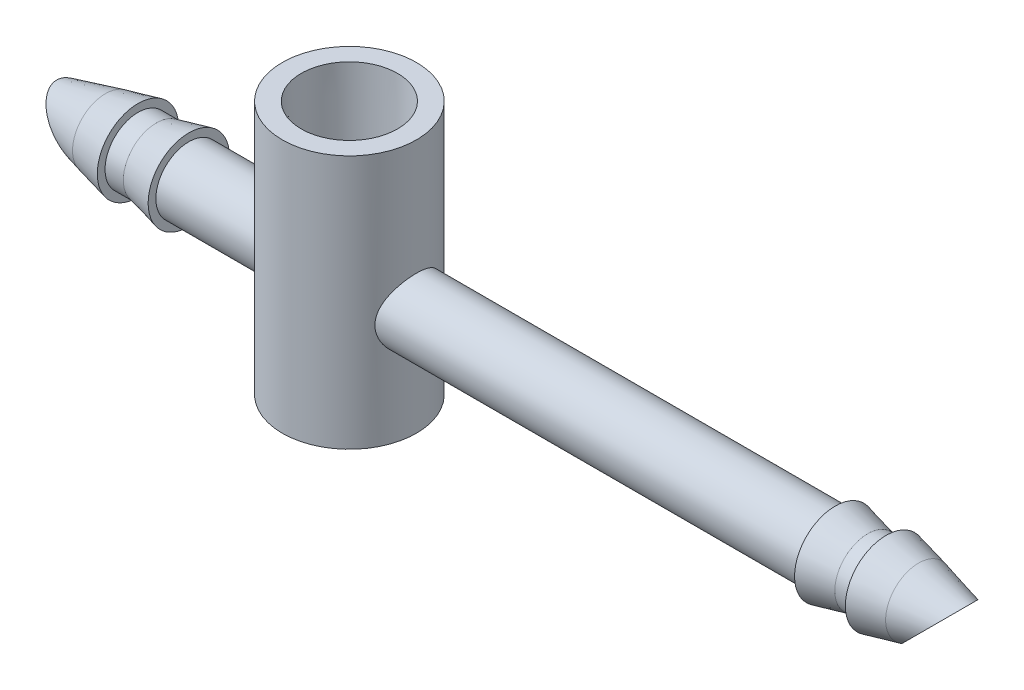
ISO-10303-21;
HEADER;
FILE_DESCRIPTION(('STEP AP214'),'2;1');
FILE_NAME('part.step','',(''),(''),'','','');
FILE_SCHEMA(('AUTOMOTIVE_DESIGN { 1 0 10303 214 1 1 1 1 }'));
ENDSEC;
DATA;
#1=APPLICATION_CONTEXT('core data for automotive mechanical design processes');
#2=APPLICATION_PROTOCOL_DEFINITION('international standard','automotive_design',2000,#1);
#3=PRODUCT_CONTEXT('',#1,'mechanical');
#4=PRODUCT('Part','Part','',(#3));
#5=PRODUCT_RELATED_PRODUCT_CATEGORY('part','',(#4));
#6=PRODUCT_DEFINITION_FORMATION('','',#4);
#7=PRODUCT_DEFINITION_CONTEXT('part definition',#1,'design');
#8=PRODUCT_DEFINITION('design','',#6,#7);
#9=PRODUCT_DEFINITION_SHAPE('','',#8);
#10=(LENGTH_UNIT() NAMED_UNIT(*) SI_UNIT(.MILLI.,.METRE.));
#11=(NAMED_UNIT(*) PLANE_ANGLE_UNIT() SI_UNIT($,.RADIAN.));
#12=(NAMED_UNIT(*) SI_UNIT($,.STERADIAN.) SOLID_ANGLE_UNIT());
#13=UNCERTAINTY_MEASURE_WITH_UNIT(LENGTH_MEASURE(1.E-05),#10,'distance_accuracy_value','');
#14=(GEOMETRIC_REPRESENTATION_CONTEXT(3) GLOBAL_UNCERTAINTY_ASSIGNED_CONTEXT((#13)) GLOBAL_UNIT_ASSIGNED_CONTEXT((#10,
#11,#12)) REPRESENTATION_CONTEXT('',''));
#15=CARTESIAN_POINT('',(0.,0.,0.));
#16=DIRECTION('',(0.,0.,1.));
#17=DIRECTION('',(1.,0.,0.));
#18=AXIS2_PLACEMENT_3D('',#15,#16,#17);
#19=CARTESIAN_POINT('',(-28.4481004842469,6.604,0.));
#20=DIRECTION('',(1.,0.,0.));
#21=DIRECTION('',(0.,0.,-1.));
#22=AXIS2_PLACEMENT_3D('',#19,#20,#21);
#23=CYLINDRICAL_SURFACE('',#22,0.9906);
#24=CARTESIAN_POINT('',(-12.7289734303222,5.89888257400853,-0.695771352933691));
#25=CARTESIAN_POINT('',(-12.7198210557029,5.93729081542466,-0.734691909886504));
#26=CARTESIAN_POINT('',(-12.7106974482991,5.97899520891978,-0.770494047879035));
#27=CARTESIAN_POINT('',(-12.6936329451425,6.06799191534761,-0.834872759712388));
#28=CARTESIAN_POINT('',(-12.6856951378107,6.11529826391608,-0.86343059613292));
#29=CARTESIAN_POINT('',(-12.6720920998009,6.21436475017099,-0.912429075577457));
#30=CARTESIAN_POINT('',(-12.6664302151197,6.26613131044383,-0.932857766922668));
#31=CARTESIAN_POINT('',(-12.6583027401911,6.3725464706193,-0.964779094447687));
#32=CARTESIAN_POINT('',(-12.6558337597402,6.42719194941512,-0.976281203610409));
#33=CARTESIAN_POINT('',(-12.6546245786434,6.53525361433799,-0.989644115704922));
#34=CARTESIAN_POINT('',(-12.6557256529603,6.58861866643314,-0.991905488491464));
#35=CARTESIAN_POINT('',(-12.6613194785732,6.69484414038392,-0.987856821692699));
#36=CARTESIAN_POINT('',(-12.6658125488571,6.74770451430548,-0.981545975919998));
#37=CARTESIAN_POINT('',(-12.6776374831539,6.85028673509259,-0.960891015949048));
#38=CARTESIAN_POINT('',(-12.6849063951821,6.90005158004341,-0.946722098687032));
#39=CARTESIAN_POINT('',(-12.7015927221418,6.99646385075008,-0.910991534371383));
#40=CARTESIAN_POINT('',(-12.7110106644189,7.0431105077023,-0.889428072133162));
#41=CARTESIAN_POINT('',(-12.7317169304972,7.13484614458355,-0.838097896427136));
#42=CARTESIAN_POINT('',(-12.7430811251007,7.17969600369928,-0.807934680140224));
#43=CARTESIAN_POINT('',(-12.7661877379024,7.26386507367981,-0.740788105056009));
#44=CARTESIAN_POINT('',(-12.7779302970076,7.30318219414291,-0.703802180606799));
#45=CARTESIAN_POINT('',(-12.8013452744523,7.37736069372691,-0.621633339734724));
#46=CARTESIAN_POINT('',(-12.8129790877963,7.4118630751004,-0.576113841297732));
#47=CARTESIAN_POINT('',(-12.8342895633808,7.47269814680199,-0.479488313833545));
#48=CARTESIAN_POINT('',(-12.8439665620611,7.49903224193901,-0.428383247477666));
#49=CARTESIAN_POINT('',(-12.8601255485324,7.54203163803995,-0.32330312733805));
#50=CARTESIAN_POINT('',(-12.8666818824728,7.55892379902835,-0.269432805053773));
#51=CARTESIAN_POINT('',(-12.8762406599685,7.58332857997896,-0.15931091584928));
#52=CARTESIAN_POINT('',(-12.8792449156975,7.59084598279504,-0.103060578333509));
#53=CARTESIAN_POINT('',(-12.8812966034906,7.59599065941,0.00624903850359188));
#54=CARTESIAN_POINT('',(-12.8805906725758,7.59423437004041,0.0592755883970689));
#55=CARTESIAN_POINT('',(-12.8758598203524,7.58231938156515,0.164218409567229));
#56=CARTESIAN_POINT('',(-12.8718351256625,7.57216125617092,0.216134756404773));
#57=CARTESIAN_POINT('',(-12.8609447546203,7.54406243823438,0.316628186865464));
#58=CARTESIAN_POINT('',(-12.8541230442007,7.5262419866593,0.36524394513302));
#59=CARTESIAN_POINT('',(-12.8382587039336,7.48344419022272,0.458819378163169));
#60=CARTESIAN_POINT('',(-12.829215579395,7.45846525101728,0.503778235591009));
#61=CARTESIAN_POINT('',(-12.8091614111647,7.40056067789199,0.591335503362882));
#62=CARTESIAN_POINT('',(-12.7980717644769,7.36728557959903,0.63368459113759));
#63=CARTESIAN_POINT('',(-12.7752831079412,7.29442366062914,0.71237740098369));
#64=CARTESIAN_POINT('',(-12.7635838436361,7.25483418986139,0.748718588488571));
#65=CARTESIAN_POINT('',(-12.7399851634869,7.16782519884078,0.816453936094898));
#66=CARTESIAN_POINT('',(-12.7281117211841,7.12008985461989,0.847453102720782));
#67=CARTESIAN_POINT('',(-12.7061175695556,7.01969531666786,0.900954697243561));
#68=CARTESIAN_POINT('',(-12.6959966317266,6.96703676623825,0.923458233310035));
#69=CARTESIAN_POINT('',(-12.6788009517392,6.85912832641404,0.958834626440317));
#70=CARTESIAN_POINT('',(-12.6716762199282,6.80393955145375,0.971868408568312));
#71=CARTESIAN_POINT('',(-12.6610394391697,6.69181737237689,0.988322755007606));
#72=CARTESIAN_POINT('',(-12.6575252437086,6.63488502559643,0.991749033209678));
#73=CARTESIAN_POINT('',(-12.6545414373469,6.52512819698705,0.988873577453069));
#74=CARTESIAN_POINT('',(-12.654808341205,6.47229253417721,0.983229728436972));
#75=CARTESIAN_POINT('',(-12.6585609395088,6.36831491477222,0.963607746403885));
#76=CARTESIAN_POINT('',(-12.6620466888997,6.31717298710438,0.9496294711206));
#77=CARTESIAN_POINT('',(-12.6715973711185,6.21863217812165,0.914051818481583));
#78=CARTESIAN_POINT('',(-12.677628840721,6.17119387577139,0.892551918353956));
#79=CARTESIAN_POINT('',(-12.6914637554091,6.08045415028152,0.842540108838486));
#80=CARTESIAN_POINT('',(-12.6992676801297,6.03715385142046,0.814026301279018));
#81=CARTESIAN_POINT('',(-12.7162049689566,5.95329440621155,0.748897175483832));
#82=CARTESIAN_POINT('',(-12.7253887269193,5.9130316786326,0.711913034733178));
#83=CARTESIAN_POINT('',(-12.7436232443848,5.83910049929975,0.631813993044503));
#84=CARTESIAN_POINT('',(-12.7526739701062,5.80543369659719,0.588697563607564));
#85=CARTESIAN_POINT('',(-12.7699017696517,5.74452124539252,0.495757820823608));
#86=CARTESIAN_POINT('',(-12.7780377789376,5.71753807930111,0.445754064036738));
#87=CARTESIAN_POINT('',(-12.7920627832801,5.67243482662575,0.341602860397827));
#88=CARTESIAN_POINT('',(-12.7979523737161,5.65431239127973,0.287456516049863));
#89=CARTESIAN_POINT('',(-12.8066000691089,5.62805967896882,0.178498683675544));
#90=CARTESIAN_POINT('',(-12.8094574172375,5.61961196200246,0.123771738304363));
#91=CARTESIAN_POINT('',(-12.812043330463,5.61195732012748,0.0136147931504438));
#92=CARTESIAN_POINT('',(-12.8117731022372,5.61274683132501,-0.0418149272439259));
#93=CARTESIAN_POINT('',(-12.8082158928685,5.62330168193909,-0.149406651972828));
#94=CARTESIAN_POINT('',(-12.8050527618175,5.63269855103012,-0.201609577144477));
#95=CARTESIAN_POINT('',(-12.7962317962432,5.65962173514863,-0.303687043615899));
#96=CARTESIAN_POINT('',(-12.7905722136143,5.67715374714477,-0.353559926224267));
#97=CARTESIAN_POINT('',(-12.7772598620385,5.72012873859672,-0.450465189321868));
#98=CARTESIAN_POINT('',(-12.7695757179812,5.74569759103285,-0.497437053190829));
#99=CARTESIAN_POINT('',(-12.7531042200017,5.80388961315551,-0.586454303403846));
#100=CARTESIAN_POINT('',(-12.7443194414757,5.83649643925595,-0.628510761260257));
#101=CARTESIAN_POINT('',(-12.7333044227002,5.88089856275711,-0.677186166317929));
#102=CARTESIAN_POINT('',(-12.7311381218884,5.88979837458205,-0.686565982208218));
#103=CARTESIAN_POINT('',(-12.7289734303222,5.89888257400853,-0.695771352933691));
#104=B_SPLINE_CURVE_WITH_KNOTS('',3,(#24,#25,#26,#27,#28,#29,#30,#31,#32,#33,#34,#35,#36,#37,
#38,#39,#40,#41,#42,#43,#44,#45,#46,#47,#48,#49,#50,#51,#52,#53,#54,#55,#56,#57,#58,#59,#60,#61,
#62,#63,#64,#65,#66,#67,#68,#69,#70,#71,#72,#73,#74,#75,#76,#77,#78,#79,#80,#81,#82,#83,#84,#85,
#86,#87,#88,#89,#90,#91,#92,#93,#94,#95,#96,#97,#98,#99,#100,#101,#102,#103),.UNSPECIFIED.,.T.,
.F.,(4,2,2,2,2,2,2,2,2,2,2,2,2,2,2,2,2,2,2,2,2,2,2,2,2,2,2,2,2,2,2,2,2,2,2,2,2,2,2,4),(0.,
0.166292525898598,0.333010880590813,0.499973451222633,0.666758596215862,0.826231853063031,
0.985720108854799,1.14178773158851,1.29789369266173,1.46286991978877,1.62790831250002,
1.80192955347372,1.97592084908256,2.1455290321176,2.31505064828308,2.47345175193191,
2.63184204020396,2.78783264597879,2.94385802113901,3.10810732301385,3.27242574126022,
3.4460186424927,3.61958889244673,3.79013579432564,3.96058124495641,4.11921135606181,
4.27784417501581,4.43445371299175,4.59110568087919,4.75667640908608,4.92228847905946,
5.09363083880099,5.26492775523477,5.43042684687933,5.59586208801305,5.75453032784382,
5.91330984972286,6.07471172639925,6.23574275240292,6.27507375045692),.UNSPECIFIED.);
#105=CARTESIAN_POINT('',(-12.7289734303222,5.89888257400853,-0.695771352933691));
#106=VERTEX_POINT('',#105);
#107=EDGE_CURVE('E50',#106,#106,#104,.T.);
#108=ORIENTED_EDGE('',*,*,#107,.T.);
#109=EDGE_LOOP('',(#108));
#110=FACE_BOUND('',#109,.T.);
#111=CARTESIAN_POINT('',(-27.178,6.604,0.));
#112=DIRECTION('',(-0.707106781186549,-0.707106781186546,0.));
#113=DIRECTION('',(0.707106781186546,-0.707106781186549,0.));
#114=AXIS2_PLACEMENT_3D('',#111,#112,#113);
#115=ELLIPSE('',#114,1.40091995488679,0.9906);
#116=CARTESIAN_POINT('',(-26.1874,5.6134,0.));
#117=VERTEX_POINT('',#116);
#118=EDGE_CURVE('E150',#117,#117,#115,.T.);
#119=ORIENTED_EDGE('',*,*,#118,.T.);
#120=EDGE_LOOP('',(#119));
#121=FACE_BOUND('',#120,.T.);
#122=ADVANCED_FACE('F45',(#110,#121),#23,.F.);
#123=CARTESIAN_POINT('',(25.4,6.604,-3.54734504026462E-13));
#124=DIRECTION('',(-1.,0.,0.));
#125=DIRECTION('',(0.,0.,-1.));
#126=AXIS2_PLACEMENT_3D('',#123,#124,#125);
#127=CONICAL_SURFACE('',#126,2.0574,0.233179800646816);
#128=CARTESIAN_POINT('',(23.368,6.604,0.));
#129=DIRECTION('',(-1.,0.,0.));
#130=DIRECTION('',(0.,0.,1.));
#131=AXIS2_PLACEMENT_3D('',#128,#129,#130);
#132=CIRCLE('',#131,2.54);
#133=CARTESIAN_POINT('',(23.368,6.604,2.53999999999992));
#134=VERTEX_POINT('',#133);
#135=EDGE_CURVE('E429',#134,#134,#132,.T.);
#136=ORIENTED_EDGE('',*,*,#135,.F.);
#137=EDGE_LOOP('',(#136));
#138=FACE_BOUND('',#137,.T.);
#139=CARTESIAN_POINT('',(25.4,6.604,-3.54734504026462E-13));
#140=DIRECTION('',(-1.,0.,0.));
#141=DIRECTION('',(0.,0.,1.));
#142=AXIS2_PLACEMENT_3D('',#139,#140,#141);
#143=CIRCLE('',#142,2.0574);
#144=CARTESIAN_POINT('',(25.399999999998,4.82599999999802,1.03518634071084));
#145=VERTEX_POINT('',#144);
#146=CARTESIAN_POINT('',(25.4,4.82599999999998,-1.03518634071392));
#147=VERTEX_POINT('',#146);
#148=EDGE_CURVE('E95',#145,#147,#143,.T.);
#149=ORIENTED_EDGE('',*,*,#148,.T.);
#150=CARTESIAN_POINT('',(26.7664434509025,6.19244345090247,-3.6406410642274E-13));
#151=DIRECTION('',(0.707106781186549,-0.707106781186546,0.));
#152=DIRECTION('',(-0.707106781186546,-0.707106781186549,0.));
#153=AXIS2_PLACEMENT_3D('',#150,#151,#152);
#154=ELLIPSE('',#153,2.45064780386188,1.68328801343724);
#155=EDGE_CURVE('E96',#147,#145,#154,.F.);
#156=ORIENTED_EDGE('',*,*,#155,.T.);
#157=EDGE_LOOP('',(#149,#156));
#158=FACE_BOUND('',#157,.T.);
#159=ADVANCED_FACE('F129',(#138,#158),#127,.T.);
#160=CARTESIAN_POINT('',(28.448,6.604,-3.7601857426805E-13));
#161=DIRECTION('',(-1.,0.,0.));
#162=DIRECTION('',(0.,0.,-1.));
#163=AXIS2_PLACEMENT_3D('',#160,#161,#162);
#164=CONICAL_SURFACE('',#163,1.27,0.252806291901757);
#165=ORIENTED_EDGE('',*,*,#148,.F.);
#166=CARTESIAN_POINT('',(26.7356404494382,6.16164044943821,-3.63833126489173E-13));
#167=DIRECTION('',(0.707106781186549,-0.707106781186546,0.));
#168=DIRECTION('',(-0.707106781186546,-0.707106781186549,0.));
#169=AXIS2_PLACEMENT_3D('',#166,#167,#168);
#170=ELLIPSE('',#169,2.42164210006358,1.65423494656199);
#171=CARTESIAN_POINT('',(28.448,7.874,-3.76876041564533E-13));
#172=VERTEX_POINT('',#171);
#173=EDGE_CURVE('E12',#145,#172,#170,.F.);
#174=ORIENTED_EDGE('',*,*,#173,.T.);
#175=CARTESIAN_POINT('',(28.448,6.604,-3.7601857426805E-13));
#176=DIRECTION('',(-1.,0.,0.));
#177=DIRECTION('',(0.,0.,1.));
#178=AXIS2_PLACEMENT_3D('',#175,#176,#177);
#179=CIRCLE('',#178,1.27);
#180=CARTESIAN_POINT('',(28.448,7.87400000137654,-0.00053696174757791));
#181=VERTEX_POINT('',#180);
#182=EDGE_CURVE('E89',#172,#181,#179,.T.);
#183=ORIENTED_EDGE('',*,*,#182,.T.);
#184=EDGE_CURVE('E59',#181,#147,#170,.F.);
#185=ORIENTED_EDGE('',*,*,#184,.T.);
#186=EDGE_LOOP('',(#165,#174,#183,#185));
#187=FACE_BOUND('',#186,.T.);
#188=ADVANCED_FACE('F101',(#187),#164,.T.);
#189=CARTESIAN_POINT('',(25.4,6.604,0.));
#190=DIRECTION('',(-1.,0.,0.));
#191=DIRECTION('',(0.,0.,1.));
#192=AXIS2_PLACEMENT_3D('',#189,#190,#191);
#193=CYLINDRICAL_SURFACE('',#192,2.0574);
#194=CARTESIAN_POINT('',(-6.50875552174331,6.604,2.0574));
#195=CARTESIAN_POINT('',(-6.50874557928772,6.71150420791799,2.05739168198061));
#196=CARTESIAN_POINT('',(-6.50393545640232,6.81915507082698,2.04891744821865));
#197=CARTESIAN_POINT('',(-6.48538025318272,7.03117468118683,2.01543880223582));
#198=CARTESIAN_POINT('',(-6.47161571946703,7.13553576285349,1.9903983981367));
#199=CARTESIAN_POINT('',(-6.43712952178396,7.33751453308569,1.92511268920919));
#200=CARTESIAN_POINT('',(-6.4164438571538,7.43516402645166,1.88494592910289));
#201=CARTESIAN_POINT('',(-6.37050135456076,7.62231413016998,1.79078659512008));
#202=CARTESIAN_POINT('',(-6.34524441337746,7.71181455644601,1.7367937090352));
#203=CARTESIAN_POINT('',(-6.29055366642618,7.88797473907386,1.61148805270902));
#204=CARTESIAN_POINT('',(-6.26094745491142,7.97384556438868,1.53914091610817));
#205=CARTESIAN_POINT('',(-6.20228788038235,8.13284483653371,1.38133387499145));
#206=CARTESIAN_POINT('',(-6.17323479081451,8.20596711948638,1.29586766479248));
#207=CARTESIAN_POINT('',(-6.11671561310839,8.34199800251583,1.10751810770709));
#208=CARTESIAN_POINT('',(-6.08947224018541,8.40394550808865,1.00386753386904));
#209=CARTESIAN_POINT('',(-6.04186517826461,8.50916581326021,0.786028878270575));
#210=CARTESIAN_POINT('',(-6.02149730240946,8.55244998243134,0.671847263561792));
#211=CARTESIAN_POINT('',(-5.9911761439073,8.61602142068051,0.444538201979344));
#212=CARTESIAN_POINT('',(-5.98060119031474,8.63768947934949,0.331881704783649));
#213=CARTESIAN_POINT('',(-5.96874368730402,8.66195104834268,0.104073400678027));
#214=CARTESIAN_POINT('',(-5.96745574605245,8.6645556265141,-0.0110769194143754));
#215=CARTESIAN_POINT('',(-5.97401417713941,8.65117165883461,-0.230263521114504));
#216=CARTESIAN_POINT('',(-5.98110324314691,8.63672474906178,-0.334421700036052));
#217=CARTESIAN_POINT('',(-6.00248661444408,8.59239314297677,-0.538613201212911));
#218=CARTESIAN_POINT('',(-6.01678145742144,8.56250729462268,-0.63864621504995));
#219=CARTESIAN_POINT('',(-6.05151342863848,8.48792584674471,-0.8335252963867));
#220=CARTESIAN_POINT('',(-6.07203491091923,8.44302593598992,-0.928277516195344));
#221=CARTESIAN_POINT('',(-6.11735215279327,8.33995962449312,-1.10913684766394));
#222=CARTESIAN_POINT('',(-6.1421494580255,8.28178842393505,-1.19524081525091));
#223=CARTESIAN_POINT('',(-6.19636293845209,8.1476753244575,-1.36480619586473));
#224=CARTESIAN_POINT('',(-6.22599416395538,8.07059104875171,-1.44729614506715));
#225=CARTESIAN_POINT('',(-6.28504407463586,7.90391194505644,-1.59869141906319));
#226=CARTESIAN_POINT('',(-6.31446259186725,7.81430817101006,-1.66758694401346));
#227=CARTESIAN_POINT('',(-6.37163576662624,7.61858216504068,-1.79384143564679));
#228=CARTESIAN_POINT('',(-6.39918705295435,7.5117940524363,-1.85026921905771));
#229=CARTESIAN_POINT('',(-6.44672790512336,7.28856343765559,-1.94393382379989));
#230=CARTESIAN_POINT('',(-6.46672511524617,7.17213084143848,-1.98119005952042));
#231=CARTESIAN_POINT('',(-6.49472357113542,6.94252300139371,-2.03249282174962));
#232=CARTESIAN_POINT('',(-6.5035409680045,6.82980564370966,-2.04812721141078));
#233=CARTESIAN_POINT('',(-6.51050940255273,6.6030389072869,-2.06052512165686));
#234=CARTESIAN_POINT('',(-6.50866737322001,6.48899044248177,-2.05730090803485));
#235=CARTESIAN_POINT('',(-6.49538899144927,6.2753763352689,-2.03353043997576));
#236=CARTESIAN_POINT('',(-6.48496613023685,6.17553411990587,-2.01481290154899));
#237=CARTESIAN_POINT('',(-6.45717502217301,5.98058365576457,-1.96326739292366));
#238=CARTESIAN_POINT('',(-6.43980462439449,5.88547688332231,-1.93043505260796));
#239=CARTESIAN_POINT('',(-6.39912462437631,5.69768664631415,-1.84997597836781));
#240=CARTESIAN_POINT('',(-6.37557671203645,5.60532071922807,-1.80173312165812));
#241=CARTESIAN_POINT('',(-6.32542126500839,5.42946809021876,-1.69236650089145));
#242=CARTESIAN_POINT('',(-6.29881217166028,5.34598595366473,-1.63123616161635));
#243=CARTESIAN_POINT('',(-6.24167285361336,5.17974104156459,-1.48920358128868));
#244=CARTESIAN_POINT('',(-6.21105679710818,5.09827958601018,-1.40680586118399));
#245=CARTESIAN_POINT('',(-6.1521546359557,4.94995154018412,-1.22899377168047));
#246=CARTESIAN_POINT('',(-6.12386923152608,4.88308932620433,-1.13357551311444));
#247=CARTESIAN_POINT('',(-6.07196117298785,4.76460334212062,-0.929382875633139));
#248=CARTESIAN_POINT('',(-6.0484599645003,4.71336309028509,-0.820352928064257));
#249=CARTESIAN_POINT('',(-6.00968338112619,4.63045130432911,-0.593736424667756));
#250=CARTESIAN_POINT('',(-5.99440104365052,4.59876320330623,-0.476157207500129));
#251=CARTESIAN_POINT('',(-5.97485896815806,4.55849399041956,-0.247154096980267));
#252=CARTESIAN_POINT('',(-5.96973435719073,4.54809702182788,-0.136122518123854));
#253=CARTESIAN_POINT('',(-5.96841432607618,4.54540586029094,0.0861974314470987));
#254=CARTESIAN_POINT('',(-5.97221600500946,4.55310578610863,0.197485706995968));
#255=CARTESIAN_POINT('',(-5.98781723734876,4.58516434150296,0.40990480982889));
#256=CARTESIAN_POINT('',(-5.99910601005543,4.60845991146148,0.511237478123646));
#257=CARTESIAN_POINT('',(-6.02810230285126,4.66964835915245,0.708405927560609));
#258=CARTESIAN_POINT('',(-6.04581077591086,4.70754340415187,0.804240890149963));
#259=CARTESIAN_POINT('',(-6.08699964167541,4.79860150017807,0.992386013312486));
#260=CARTESIAN_POINT('',(-6.11069849342235,4.85235951938473,1.08435900142147));
#261=CARTESIAN_POINT('',(-6.16134800090105,4.97285898197512,1.25836769723598));
#262=CARTESIAN_POINT('',(-6.18830015187709,5.03960640409456,1.34039880058821));
#263=CARTESIAN_POINT('',(-6.24581307752378,5.19166618766214,1.50051209137004));
#264=CARTESIAN_POINT('',(-6.27647142076428,5.27814734342916,1.5774533171089));
#265=CARTESIAN_POINT('',(-6.33572116470845,5.46328617709944,1.71612055901833));
#266=CARTESIAN_POINT('',(-6.36431083365562,5.56195387394763,1.77783392925048));
#267=CARTESIAN_POINT('',(-6.41664818932089,5.77233408403039,1.88560557359411));
#268=CARTESIAN_POINT('',(-6.44024932702002,5.88432072146761,1.93121113101302));
#269=CARTESIAN_POINT('',(-6.46856945697547,6.05778894235697,1.98449363809278));
#270=CARTESIAN_POINT('',(-6.47682492798579,6.11647040796528,1.99972648546958));
#271=CARTESIAN_POINT('',(-6.49065310198282,6.23523853494253,2.02499023479485));
#272=CARTESIAN_POINT('',(-6.4962277043888,6.29532416970121,2.03502482014852));
#273=CARTESIAN_POINT('',(-6.50311858620745,6.39692601811088,2.04737172558915));
#274=CARTESIAN_POINT('',(-6.50522709823155,6.43821983553214,2.05112839833056));
#275=CARTESIAN_POINT('',(-6.50804752994183,6.52100180546243,2.05614422088374));
#276=CARTESIAN_POINT('',(-6.50875936077097,6.56248997016754,2.05740321179273));
#277=CARTESIAN_POINT('',(-6.50875552174331,6.604,2.0574));
#278=B_SPLINE_CURVE_WITH_KNOTS('',3,(#194,#195,#196,#197,#198,#199,#200,#201,#202,#203,#204,
#205,#206,#207,#208,#209,#210,#211,#212,#213,#214,#215,#216,#217,#218,#219,#220,#221,#222,#223,
#224,#225,#226,#227,#228,#229,#230,#231,#232,#233,#234,#235,#236,#237,#238,#239,#240,#241,#242,
#243,#244,#245,#246,#247,#248,#249,#250,#251,#252,#253,#254,#255,#256,#257,#258,#259,#260,#261,
#262,#263,#264,#265,#266,#267,#268,#269,#270,#271,#272,#273,#274,#275,#276,#277),.UNSPECIFIED.,
.T.,.F.,(4,2,2,2,2,2,2,2,2,2,2,2,2,2,2,2,2,2,2,2,2,2,2,2,2,2,2,2,2,2,2,2,2,2,2,2,2,2,2,2,2,4),
(0.,0.322345220368503,0.645393082218825,0.966786119743357,1.28818641529855,1.63508966177514,
1.98216017245255,2.35158324199954,2.72078094257035,3.06450227950766,3.40802404338032,
3.72272419607124,4.03744783484194,4.35664142726778,4.67595064569247,5.02462879443859,
5.37355738461643,5.74326226404532,6.11259201519295,6.45302541805827,6.79323742482747,
7.09821203017433,7.40328112750881,7.72251451135124,8.04191116455726,8.39983273261035,
8.75786144495252,9.1240791281137,9.48998608053387,9.82311054875528,10.156126771164,
10.468484237902,10.7808880914474,11.1069472363015,11.4331568154754,11.7907795522551,
12.1486982840036,12.5159980989333,12.6993140940367,12.8825000160731,13.0069575492404,
13.1314230001561),.UNSPECIFIED.);
#279=CARTESIAN_POINT('',(-6.50875552174331,6.604,2.0574));
#280=VERTEX_POINT('',#279);
#281=EDGE_CURVE('E374',#280,#280,#278,.T.);
#282=ORIENTED_EDGE('',*,*,#281,.F.);
#283=EDGE_LOOP('',(#282));
#284=FACE_BOUND('',#283,.T.);
#285=CARTESIAN_POINT('',(20.193,6.604,0.));
#286=DIRECTION('',(1.,0.,0.));
#287=DIRECTION('',(0.,0.,-1.));
#288=AXIS2_PLACEMENT_3D('',#285,#286,#287);
#289=CIRCLE('',#288,2.0574);
#290=CARTESIAN_POINT('',(20.193,6.604,-2.0574));
#291=VERTEX_POINT('',#290);
#292=EDGE_CURVE('E428',#291,#291,#289,.F.);
#293=ORIENTED_EDGE('',*,*,#292,.T.);
#294=EDGE_LOOP('',(#293));
#295=FACE_BOUND('',#294,.T.);
#296=ADVANCED_FACE('F128',(#284,#295),#193,.T.);
#297=CARTESIAN_POINT('',(-25.4,6.604,-3.54734504026462E-13));
#298=DIRECTION('',(1.,0.,0.));
#299=DIRECTION('',(0.,0.,-1.));
#300=AXIS2_PLACEMENT_3D('',#297,#298,#299);
#301=CONICAL_SURFACE('',#300,2.0574,0.233179800646816);
#302=CARTESIAN_POINT('',(-23.368,6.604,0.));
#303=DIRECTION('',(-1.,0.,0.));
#304=DIRECTION('',(0.,0.,1.));
#305=AXIS2_PLACEMENT_3D('',#302,#303,#304);
#306=CIRCLE('',#305,2.54);
#307=CARTESIAN_POINT('',(-23.368,6.604,2.53999999999992));
#308=VERTEX_POINT('',#307);
#309=EDGE_CURVE('E337',#308,#308,#306,.T.);
#310=ORIENTED_EDGE('',*,*,#309,.T.);
#311=EDGE_LOOP('',(#310));
#312=FACE_BOUND('',#311,.T.);
#313=CARTESIAN_POINT('',(-25.4,6.604,-3.54734504026462E-13));
#314=DIRECTION('',(-1.,0.,0.));
#315=DIRECTION('',(0.,-0.864197530867275,0.503152688200018));
#316=AXIS2_PLACEMENT_3D('',#313,#314,#315);
#317=CIRCLE('',#316,2.0574);
#318=CARTESIAN_POINT('',(-25.4,4.82599999999367,1.03518634070236));
#319=VERTEX_POINT('',#318);
#320=CARTESIAN_POINT('',(-25.3999999999944,4.8259999999944,-1.03518634070697));
#321=VERTEX_POINT('',#320);
#322=EDGE_CURVE('E265',#319,#321,#317,.T.);
#323=ORIENTED_EDGE('',*,*,#322,.F.);
#324=CARTESIAN_POINT('',(-26.7664434509025,6.19244345090247,-3.6406410642274E-13));
#325=DIRECTION('',(-0.707106781186549,-0.707106781186546,0.));
#326=DIRECTION('',(0.707106781186546,-0.707106781186549,0.));
#327=AXIS2_PLACEMENT_3D('',#324,#325,#326);
#328=ELLIPSE('',#327,2.45064780386188,1.68328801343724);
#329=EDGE_CURVE('E74',#319,#321,#328,.F.);
#330=ORIENTED_EDGE('',*,*,#329,.T.);
#331=EDGE_LOOP('',(#323,#330));
#332=FACE_BOUND('',#331,.T.);
#333=ADVANCED_FACE('F342',(#312,#332),#301,.T.);
#334=CARTESIAN_POINT('',(-28.448,6.604,-3.7601857426805E-13));
#335=DIRECTION('',(1.,0.,0.));
#336=DIRECTION('',(0.,0.,-1.));
#337=AXIS2_PLACEMENT_3D('',#334,#335,#336);
#338=CONICAL_SURFACE('',#337,1.27,0.252806291901757);
#339=ORIENTED_EDGE('',*,*,#322,.T.);
#340=CARTESIAN_POINT('',(-26.7356404494382,6.16164044943821,-3.63833126489173E-13));
#341=DIRECTION('',(-0.707106781186549,-0.707106781186546,0.));
#342=DIRECTION('',(0.707106781186546,-0.707106781186549,0.));
#343=AXIS2_PLACEMENT_3D('',#340,#341,#342);
#344=ELLIPSE('',#343,2.42164210006358,1.65423494656199);
#345=CARTESIAN_POINT('',(-28.4479999097894,7.87399990978944,-0.000536961806010743));
#346=VERTEX_POINT('',#345);
#347=EDGE_CURVE('E274',#321,#346,#344,.F.);
#348=ORIENTED_EDGE('',*,*,#347,.T.);
#349=CARTESIAN_POINT('',(-28.448,6.604,-3.7601857426805E-13));
#350=DIRECTION('',(-1.,0.,0.));
#351=DIRECTION('',(0.,0.,1.));
#352=AXIS2_PLACEMENT_3D('',#349,#350,#351);
#353=CIRCLE('',#352,1.27);
#354=CARTESIAN_POINT('',(-28.448,7.874,-3.76470870858064E-13));
#355=VERTEX_POINT('',#354);
#356=EDGE_CURVE('E244',#355,#346,#353,.T.);
#357=ORIENTED_EDGE('',*,*,#356,.F.);
#358=EDGE_CURVE('E272',#355,#319,#344,.F.);
#359=ORIENTED_EDGE('',*,*,#358,.T.);
#360=EDGE_LOOP('',(#339,#348,#357,#359));
#361=FACE_BOUND('',#360,.T.);
#362=ADVANCED_FACE('F229',(#361),#338,.T.);
#363=CARTESIAN_POINT('',(-13.8112444782567,6.604,2.0574));
#364=CARTESIAN_POINT('',(-13.8112544207123,6.49649579208201,2.05739168198061));
#365=CARTESIAN_POINT('',(-13.8160645435977,6.38884492917302,2.04891744821865));
#366=CARTESIAN_POINT('',(-13.8346197468173,6.17682531881317,2.01543880223582));
#367=CARTESIAN_POINT('',(-13.848384280533,6.07246423714651,1.9903983981367));
#368=CARTESIAN_POINT('',(-13.882870478216,5.87048546691431,1.92511268920919));
#369=CARTESIAN_POINT('',(-13.9035561428462,5.77283597354834,1.88494592910289));
#370=CARTESIAN_POINT('',(-13.9494986454392,5.58568586983002,1.79078659512008));
#371=CARTESIAN_POINT('',(-13.9747555866225,5.49618544355399,1.73679370903519));
#372=CARTESIAN_POINT('',(-14.0294463335738,5.32002526092614,1.61148805270902));
#373=CARTESIAN_POINT('',(-14.0590525450886,5.23415443561132,1.53914091610817));
#374=CARTESIAN_POINT('',(-14.1177121196177,5.07515516346629,1.38133387499145));
#375=CARTESIAN_POINT('',(-14.1467652091855,5.00203288051362,1.29586766479248));
#376=CARTESIAN_POINT('',(-14.2032843868916,4.86600199748418,1.10751810770709));
#377=CARTESIAN_POINT('',(-14.2305277598146,4.80405449191135,1.00386753386904));
#378=CARTESIAN_POINT('',(-14.2781348217354,4.69883418673979,0.786028878270574));
#379=CARTESIAN_POINT('',(-14.2985026975905,4.65555001756866,0.671847263561791));
#380=CARTESIAN_POINT('',(-14.3288238560927,4.59197857931949,0.444538201979342));
#381=CARTESIAN_POINT('',(-14.3393988096853,4.57031052065051,0.331881704783647));
#382=CARTESIAN_POINT('',(-14.351256312696,4.54604895165732,0.104073400678025));
#383=CARTESIAN_POINT('',(-14.3525442539476,4.5434443734859,-0.0110769194143777));
#384=CARTESIAN_POINT('',(-14.3459858228606,4.55682834116539,-0.230263521114506));
#385=CARTESIAN_POINT('',(-14.3388967568531,4.57127525093822,-0.334421700036053));
#386=CARTESIAN_POINT('',(-14.3175133855559,4.61560685702323,-0.538613201212913));
#387=CARTESIAN_POINT('',(-14.3032185425786,4.64549270537733,-0.638646215049951));
#388=CARTESIAN_POINT('',(-14.2684865713615,4.7200741532553,-0.833525296386702));
#389=CARTESIAN_POINT('',(-14.2479650890808,4.76497406401008,-0.928277516195347));
#390=CARTESIAN_POINT('',(-14.2026478472067,4.86804037550688,-1.10913684766394));
#391=CARTESIAN_POINT('',(-14.1778505419745,4.92621157606496,-1.19524081525091));
#392=CARTESIAN_POINT('',(-14.1236370615479,5.0603246755425,-1.36480619586473));
#393=CARTESIAN_POINT('',(-14.0940058360446,5.13740895124829,-1.44729614506715));
#394=CARTESIAN_POINT('',(-14.0349559253641,5.30408805494356,-1.59869141906319));
#395=CARTESIAN_POINT('',(-14.0055374081327,5.39369182898994,-1.66758694401346));
#396=CARTESIAN_POINT('',(-13.9483642333738,5.58941783495932,-1.79384143564679));
#397=CARTESIAN_POINT('',(-13.9208129470456,5.6962059475637,-1.85026921905771));
#398=CARTESIAN_POINT('',(-13.8732720948766,5.91943656234442,-1.94393382379989));
#399=CARTESIAN_POINT('',(-13.8532748847538,6.03586915856153,-1.98119005952042));
#400=CARTESIAN_POINT('',(-13.8252764288646,6.26547699860629,-2.03249282174962));
#401=CARTESIAN_POINT('',(-13.8164590319955,6.37819435629035,-2.04812721141078));
#402=CARTESIAN_POINT('',(-13.8094905974473,6.6049610927131,-2.06052512165686));
#403=CARTESIAN_POINT('',(-13.81133262678,6.71900955751823,-2.05730090803485));
#404=CARTESIAN_POINT('',(-13.8246110085507,6.93262366473111,-2.03353043997576));
#405=CARTESIAN_POINT('',(-13.8350338697632,7.03246588009414,-2.01481290154898));
#406=CARTESIAN_POINT('',(-13.862824977827,7.22741634423543,-1.96326739292366));
#407=CARTESIAN_POINT('',(-13.8801953756055,7.32252311667769,-1.93043505260796));
#408=CARTESIAN_POINT('',(-13.9208753756237,7.51031335368585,-1.84997597836781));
#409=CARTESIAN_POINT('',(-13.9444232879636,7.60267928077194,-1.80173312165812));
#410=CARTESIAN_POINT('',(-13.9945787349916,7.77853190978125,-1.69236650089145));
#411=CARTESIAN_POINT('',(-14.0211878283397,7.86201404633528,-1.63123616161635));
#412=CARTESIAN_POINT('',(-14.0783271463866,8.02825895843541,-1.48920358128868));
#413=CARTESIAN_POINT('',(-14.1089432028918,8.10972041398983,-1.40680586118399));
#414=CARTESIAN_POINT('',(-14.1678453640443,8.25804845981589,-1.22899377168047));
#415=CARTESIAN_POINT('',(-14.1961307684739,8.32491067379567,-1.13357551311444));
#416=CARTESIAN_POINT('',(-14.2480388270121,8.44339665787938,-0.929382875633137));
#417=CARTESIAN_POINT('',(-14.2715400354997,8.49463690971491,-0.820352928064256));
#418=CARTESIAN_POINT('',(-14.3103166188738,8.57754869567089,-0.593736424667755));
#419=CARTESIAN_POINT('',(-14.3255989563495,8.60923679669377,-0.476157207500129));
#420=CARTESIAN_POINT('',(-14.3451410318419,8.64950600958044,-0.247154096980267));
#421=CARTESIAN_POINT('',(-14.3502656428093,8.65990297817212,-0.136122518123854));
#422=CARTESIAN_POINT('',(-14.3515856739238,8.66259413970906,0.0861974314470994));
#423=CARTESIAN_POINT('',(-14.3477839949905,8.65489421389137,0.197485706995969));
#424=CARTESIAN_POINT('',(-14.3321827626512,8.62283565849704,0.409904809828891));
#425=CARTESIAN_POINT('',(-14.3208939899446,8.59954008853852,0.511237478123647));
#426=CARTESIAN_POINT('',(-14.2918976971487,8.53835164084756,0.70840592756061));
#427=CARTESIAN_POINT('',(-14.2741892240891,8.50045659584813,0.804240890149964));
#428=CARTESIAN_POINT('',(-14.2330003583246,8.40939849982193,0.992386013312487));
#429=CARTESIAN_POINT('',(-14.2093015065776,8.35564048061527,1.08435900142147));
#430=CARTESIAN_POINT('',(-14.158651999099,8.23514101802488,1.25836769723598));
#431=CARTESIAN_POINT('',(-14.1316998481229,8.16839359590544,1.34039880058821));
#432=CARTESIAN_POINT('',(-14.0741869224762,8.01633381233786,1.50051209137004));
#433=CARTESIAN_POINT('',(-14.0435285792357,7.92985265657084,1.5774533171089));
#434=CARTESIAN_POINT('',(-13.9842788352915,7.74471382290056,1.71612055901833));
#435=CARTESIAN_POINT('',(-13.9556891663444,7.64604612605237,1.77783392925048));
#436=CARTESIAN_POINT('',(-13.9033518106791,7.43566591596961,1.88560557359411));
#437=CARTESIAN_POINT('',(-13.87975067298,7.32367927853239,1.93121113101302));
#438=CARTESIAN_POINT('',(-13.8514305430245,7.15021105764303,1.98449363809278));
#439=CARTESIAN_POINT('',(-13.8431750720142,7.09152959203472,1.99972648546958));
#440=CARTESIAN_POINT('',(-13.8293468980172,6.97276146505747,2.02499023479485));
#441=CARTESIAN_POINT('',(-13.8237722956112,6.91267583029879,2.03502482014852));
#442=CARTESIAN_POINT('',(-13.8168814137925,6.81107398188912,2.04737172558915));
#443=CARTESIAN_POINT('',(-13.8147729017685,6.76978016446786,2.05112839833056));
#444=CARTESIAN_POINT('',(-13.8119524700582,6.68699819453757,2.05614422088374));
#445=CARTESIAN_POINT('',(-13.811240639229,6.64551002983246,2.05740321179273));
#446=CARTESIAN_POINT('',(-13.8112444782567,6.604,2.0574));
#447=B_SPLINE_CURVE_WITH_KNOTS('',3,(#363,#364,#365,#366,#367,#368,#369,#370,#371,#372,#373,
#374,#375,#376,#377,#378,#379,#380,#381,#382,#383,#384,#385,#386,#387,#388,#389,#390,#391,#392,
#393,#394,#395,#396,#397,#398,#399,#400,#401,#402,#403,#404,#405,#406,#407,#408,#409,#410,#411,
#412,#413,#414,#415,#416,#417,#418,#419,#420,#421,#422,#423,#424,#425,#426,#427,#428,#429,#430,
#431,#432,#433,#434,#435,#436,#437,#438,#439,#440,#441,#442,#443,#444,#445,#446),.UNSPECIFIED.,
.T.,.F.,(4,2,2,2,2,2,2,2,2,2,2,2,2,2,2,2,2,2,2,2,2,2,2,2,2,2,2,2,2,2,2,2,2,2,2,2,2,2,2,2,2,4),
(0.,0.322345220368503,0.645393082218825,0.966786119743358,1.28818641529855,1.63508966177514,
1.98216017245255,2.35158324199954,2.72078094257035,3.06450227950766,3.40802404338032,
3.72272419607124,4.03744783484194,4.35664142726778,4.67595064569247,5.02462879443859,
5.37355738461643,5.74326226404533,6.11259201519295,6.45302541805827,6.79323742482747,
7.09821203017433,7.40328112750881,7.72251451135124,8.04191116455727,8.39983273261035,
8.75786144495252,9.1240791281137,9.48998608053387,9.82311054875528,10.156126771164,
10.468484237902,10.7808880914474,11.1069472363015,11.4331568154754,11.7907795522551,
12.1486982840036,12.5159980989333,12.6993140940367,12.8825000160731,13.0069575492404,
13.1314230001561),.UNSPECIFIED.);
#448=CARTESIAN_POINT('',(-13.8112444782567,6.604,2.0574));
#449=VERTEX_POINT('',#448);
#450=EDGE_CURVE('E375',#449,#449,#447,.T.);
#451=ORIENTED_EDGE('',*,*,#450,.F.);
#452=EDGE_LOOP('',(#451));
#453=FACE_BOUND('',#452,.T.);
#454=CARTESIAN_POINT('',(-20.193,6.604,0.));
#455=DIRECTION('',(-1.,0.,0.));
#456=DIRECTION('',(0.,0.,1.));
#457=AXIS2_PLACEMENT_3D('',#454,#455,#456);
#458=CIRCLE('',#457,2.0574);
#459=CARTESIAN_POINT('',(-20.193,6.604,2.0574));
#460=VERTEX_POINT('',#459);
#461=EDGE_CURVE('E330',#460,#460,#458,.F.);
#462=ORIENTED_EDGE('',*,*,#461,.T.);
#463=EDGE_LOOP('',(#462));
#464=FACE_BOUND('',#463,.T.);
#465=ADVANCED_FACE('F223',(#453,#464),#193,.T.);
#466=CARTESIAN_POINT('',(-10.16,15.875,0.));
#467=DIRECTION('',(0.,-1.,0.));
#468=DIRECTION('',(0.,0.,-1.));
#469=AXIS2_PLACEMENT_3D('',#466,#467,#468);
#470=CYLINDRICAL_SURFACE('',#469,4.191);
#471=ORIENTED_EDGE('',*,*,#281,.T.);
#472=EDGE_LOOP('',(#471));
#473=FACE_BOUND('',#472,.T.);
#474=ORIENTED_EDGE('',*,*,#450,.T.);
#475=EDGE_LOOP('',(#474));
#476=FACE_BOUND('',#475,.T.);
#477=CARTESIAN_POINT('',(-10.16,15.875,0.));
#478=DIRECTION('',(0.,1.,0.));
#479=DIRECTION('',(0.,0.,1.));
#480=AXIS2_PLACEMENT_3D('',#477,#478,#479);
#481=CIRCLE('',#480,4.191);
#482=CARTESIAN_POINT('',(-10.16,15.875,4.191));
#483=VERTEX_POINT('',#482);
#484=EDGE_CURVE('E368',#483,#483,#481,.T.);
#485=ORIENTED_EDGE('',*,*,#484,.F.);
#486=EDGE_LOOP('',(#485));
#487=FACE_BOUND('',#486,.T.);
#488=CARTESIAN_POINT('',(-10.16,0.,0.));
#489=DIRECTION('',(0.,1.,0.));
#490=DIRECTION('',(0.,0.,1.));
#491=AXIS2_PLACEMENT_3D('',#488,#489,#490);
#492=CIRCLE('',#491,4.191);
#493=CARTESIAN_POINT('',(-10.16,0.,4.191));
#494=VERTEX_POINT('',#493);
#495=EDGE_CURVE('E371',#494,#494,#492,.T.);
#496=ORIENTED_EDGE('',*,*,#495,.T.);
#497=EDGE_LOOP('',(#496));
#498=FACE_BOUND('',#497,.T.);
#499=ADVANCED_FACE('F47',(#473,#476,#487,#498),#470,.T.);
#500=CARTESIAN_POINT('',(-10.16,15.875,0.));
#501=DIRECTION('',(0.,1.,0.));
#502=DIRECTION('',(0.,0.,1.));
#503=AXIS2_PLACEMENT_3D('',#500,#501,#502);
#504=PLANE('',#503);
#505=CARTESIAN_POINT('',(-10.16,15.875,0.));
#506=DIRECTION('',(0.,1.,0.));
#507=DIRECTION('',(0.,0.,1.));
#508=AXIS2_PLACEMENT_3D('',#505,#506,#507);
#509=CIRCLE('',#508,3.0099);
#510=CARTESIAN_POINT('',(-10.16,15.875,3.0099));
#511=VERTEX_POINT('',#510);
#512=EDGE_CURVE('E195',#511,#511,#509,.T.);
#513=ORIENTED_EDGE('',*,*,#512,.F.);
#514=EDGE_LOOP('',(#513));
#515=FACE_BOUND('',#514,.T.);
#516=ORIENTED_EDGE('',*,*,#484,.T.);
#517=EDGE_LOOP('',(#516));
#518=FACE_BOUND('',#517,.T.);
#519=ADVANCED_FACE('F404',(#515,#518),#504,.T.);
#520=CARTESIAN_POINT('',(-10.16,0.,0.));
#521=DIRECTION('',(0.,1.,0.));
#522=DIRECTION('',(0.,0.,1.));
#523=AXIS2_PLACEMENT_3D('',#520,#521,#522);
#524=PLANE('',#523);
#525=ORIENTED_EDGE('',*,*,#495,.F.);
#526=EDGE_LOOP('',(#525));
#527=FACE_BOUND('',#526,.T.);
#528=ADVANCED_FACE('F400',(#527),#524,.F.);
#529=CARTESIAN_POINT('',(-20.193,6.604,0.));
#530=DIRECTION('',(-1.,0.,0.));
#531=DIRECTION('',(0.,0.,1.));
#532=AXIS2_PLACEMENT_3D('',#529,#530,#531);
#533=PLANE('',#532);
#534=ORIENTED_EDGE('',*,*,#461,.F.);
#535=EDGE_LOOP('',(#534));
#536=FACE_BOUND('',#535,.T.);
#537=CARTESIAN_POINT('',(-20.193,6.604,0.));
#538=DIRECTION('',(-1.,0.,0.));
#539=DIRECTION('',(0.,0.,1.));
#540=AXIS2_PLACEMENT_3D('',#537,#538,#539);
#541=CIRCLE('',#540,2.54);
#542=CARTESIAN_POINT('',(-20.193,6.604,2.53999999999994));
#543=VERTEX_POINT('',#542);
#544=EDGE_CURVE('E283',#543,#543,#541,.T.);
#545=ORIENTED_EDGE('',*,*,#544,.F.);
#546=EDGE_LOOP('',(#545));
#547=FACE_BOUND('',#546,.T.);
#548=ADVANCED_FACE('F307',(#536,#547),#533,.F.);
#549=CARTESIAN_POINT('',(-22.225,6.604,-3.32563597524808E-13));
#550=DIRECTION('',(1.,0.,0.));
#551=DIRECTION('',(0.,0.,-1.));
#552=AXIS2_PLACEMENT_3D('',#549,#550,#551);
#553=CONICAL_SURFACE('',#552,2.0574,0.233179800646816);
#554=CARTESIAN_POINT('',(-22.225,6.604,-3.32563597524808E-13));
#555=DIRECTION('',(1.,0.,0.));
#556=DIRECTION('',(0.,0.,-1.));
#557=AXIS2_PLACEMENT_3D('',#554,#555,#556);
#558=CIRCLE('',#557,2.0574);
#559=CARTESIAN_POINT('',(-22.225,6.604,-2.05740000000033));
#560=VERTEX_POINT('',#559);
#561=EDGE_CURVE('E275',#560,#560,#558,.T.);
#562=ORIENTED_EDGE('',*,*,#561,.T.);
#563=EDGE_LOOP('',(#562));
#564=FACE_BOUND('',#563,.T.);
#565=ORIENTED_EDGE('',*,*,#544,.T.);
#566=EDGE_LOOP('',(#565));
#567=FACE_BOUND('',#566,.T.);
#568=ADVANCED_FACE('F298',(#564,#567),#553,.T.);
#569=CARTESIAN_POINT('',(-23.368,6.604,0.));
#570=DIRECTION('',(-1.,0.,0.));
#571=DIRECTION('',(0.,0.,1.));
#572=AXIS2_PLACEMENT_3D('',#569,#570,#571);
#573=PLANE('',#572);
#574=CARTESIAN_POINT('',(-23.368,6.604,0.));
#575=DIRECTION('',(-1.,0.,0.));
#576=DIRECTION('',(0.,0.,1.));
#577=AXIS2_PLACEMENT_3D('',#574,#575,#576);
#578=CIRCLE('',#577,2.0574);
#579=CARTESIAN_POINT('',(-23.368,6.604,2.0574));
#580=VERTEX_POINT('',#579);
#581=EDGE_CURVE('E380',#580,#580,#578,.F.);
#582=ORIENTED_EDGE('',*,*,#581,.F.);
#583=EDGE_LOOP('',(#582));
#584=FACE_BOUND('',#583,.T.);
#585=ORIENTED_EDGE('',*,*,#309,.F.);
#586=EDGE_LOOP('',(#585));
#587=FACE_BOUND('',#586,.T.);
#588=ADVANCED_FACE('F220',(#584,#587),#573,.F.);
#589=ORIENTED_EDGE('',*,*,#561,.F.);
#590=EDGE_LOOP('',(#589));
#591=FACE_BOUND('',#590,.T.);
#592=ORIENTED_EDGE('',*,*,#581,.T.);
#593=EDGE_LOOP('',(#592));
#594=FACE_BOUND('',#593,.T.);
#595=ADVANCED_FACE('F213',(#591,#594),#193,.T.);
#596=CARTESIAN_POINT('',(-10.2870000000001,-10.287,0.));
#597=DIRECTION('',(-0.707106781186549,-0.707106781186546,0.));
#598=DIRECTION('',(0.707106781186546,-0.707106781186549,0.));
#599=AXIS2_PLACEMENT_3D('',#596,#597,#598);
#600=PLANE('',#599);
#601=ORIENTED_EDGE('',*,*,#118,.F.);
#602=EDGE_LOOP('',(#601));
#603=FACE_BOUND('',#602,.T.);
#604=ORIENTED_EDGE('',*,*,#329,.F.);
#605=ORIENTED_EDGE('',*,*,#358,.F.);
#606=ORIENTED_EDGE('',*,*,#356,.T.);
#607=ORIENTED_EDGE('',*,*,#347,.F.);
#608=EDGE_LOOP('',(#604,#605,#606,#607));
#609=FACE_BOUND('',#608,.T.);
#610=ADVANCED_FACE('F210',(#603,#609),#600,.T.);
#611=CARTESIAN_POINT('',(20.193,6.604,0.));
#612=DIRECTION('',(1.,0.,0.));
#613=DIRECTION('',(0.,0.,1.));
#614=AXIS2_PLACEMENT_3D('',#611,#612,#613);
#615=PLANE('',#614);
#616=ORIENTED_EDGE('',*,*,#292,.F.);
#617=EDGE_LOOP('',(#616));
#618=FACE_BOUND('',#617,.T.);
#619=CARTESIAN_POINT('',(20.193,6.604,0.));
#620=DIRECTION('',(-1.,0.,0.));
#621=DIRECTION('',(0.,0.,1.));
#622=AXIS2_PLACEMENT_3D('',#619,#620,#621);
#623=CIRCLE('',#622,2.54);
#624=CARTESIAN_POINT('',(20.193,6.604,2.53999999999994));
#625=VERTEX_POINT('',#624);
#626=EDGE_CURVE('E106',#625,#625,#623,.T.);
#627=ORIENTED_EDGE('',*,*,#626,.T.);
#628=EDGE_LOOP('',(#627));
#629=FACE_BOUND('',#628,.T.);
#630=ADVANCED_FACE('F212',(#618,#629),#615,.F.);
#631=CARTESIAN_POINT('',(22.225,6.604,-3.32563597524808E-13));
#632=DIRECTION('',(-1.,0.,0.));
#633=DIRECTION('',(0.,0.,-1.));
#634=AXIS2_PLACEMENT_3D('',#631,#632,#633);
#635=CONICAL_SURFACE('',#634,2.0574,0.233179800646816);
#636=CARTESIAN_POINT('',(22.225,6.604,-3.32563597524808E-13));
#637=DIRECTION('',(-1.,0.,0.));
#638=DIRECTION('',(0.,0.,-1.));
#639=AXIS2_PLACEMENT_3D('',#636,#637,#638);
#640=CIRCLE('',#639,2.0574);
#641=CARTESIAN_POINT('',(22.225,6.604,-2.05740000000033));
#642=VERTEX_POINT('',#641);
#643=EDGE_CURVE('E280',#642,#642,#640,.T.);
#644=ORIENTED_EDGE('',*,*,#643,.T.);
#645=EDGE_LOOP('',(#644));
#646=FACE_BOUND('',#645,.T.);
#647=ORIENTED_EDGE('',*,*,#626,.F.);
#648=EDGE_LOOP('',(#647));
#649=FACE_BOUND('',#648,.T.);
#650=ADVANCED_FACE('F131',(#646,#649),#635,.T.);
#651=CARTESIAN_POINT('',(23.368,6.604,0.));
#652=DIRECTION('',(1.,0.,0.));
#653=DIRECTION('',(0.,0.,1.));
#654=AXIS2_PLACEMENT_3D('',#651,#652,#653);
#655=PLANE('',#654);
#656=CARTESIAN_POINT('',(23.368,6.604,0.));
#657=DIRECTION('',(1.,0.,0.));
#658=DIRECTION('',(0.,0.,-1.));
#659=AXIS2_PLACEMENT_3D('',#656,#657,#658);
#660=CIRCLE('',#659,2.0574);
#661=CARTESIAN_POINT('',(23.368,6.604,-2.0574));
#662=VERTEX_POINT('',#661);
#663=EDGE_CURVE('E245',#662,#662,#660,.F.);
#664=ORIENTED_EDGE('',*,*,#663,.F.);
#665=EDGE_LOOP('',(#664));
#666=FACE_BOUND('',#665,.T.);
#667=ORIENTED_EDGE('',*,*,#135,.T.);
#668=EDGE_LOOP('',(#667));
#669=FACE_BOUND('',#668,.T.);
#670=ADVANCED_FACE('F227',(#666,#669),#655,.F.);
#671=ORIENTED_EDGE('',*,*,#643,.F.);
#672=EDGE_LOOP('',(#671));
#673=FACE_BOUND('',#672,.T.);
#674=ORIENTED_EDGE('',*,*,#663,.T.);
#675=EDGE_LOOP('',(#674));
#676=FACE_BOUND('',#675,.T.);
#677=ADVANCED_FACE('F184',(#673,#676),#193,.T.);
#678=CARTESIAN_POINT('',(10.2870000000001,-10.287,0.));
#679=DIRECTION('',(0.707106781186549,-0.707106781186546,0.));
#680=DIRECTION('',(-0.707106781186546,-0.707106781186549,0.));
#681=AXIS2_PLACEMENT_3D('',#678,#679,#680);
#682=PLANE('',#681);
#683=CARTESIAN_POINT('',(27.178,6.604,0.));
#684=DIRECTION('',(0.707106781186549,-0.707106781186546,0.));
#685=DIRECTION('',(0.707106781186546,0.707106781186549,0.));
#686=AXIS2_PLACEMENT_3D('',#683,#684,#685);
#687=ELLIPSE('',#686,1.40091995488679,0.9906);
#688=CARTESIAN_POINT('',(28.1686,7.5946,0.));
#689=VERTEX_POINT('',#688);
#690=EDGE_CURVE('E148',#689,#689,#687,.T.);
#691=ORIENTED_EDGE('',*,*,#690,.F.);
#692=EDGE_LOOP('',(#691));
#693=FACE_BOUND('',#692,.T.);
#694=ORIENTED_EDGE('',*,*,#184,.F.);
#695=ORIENTED_EDGE('',*,*,#182,.F.);
#696=ORIENTED_EDGE('',*,*,#173,.F.);
#697=ORIENTED_EDGE('',*,*,#155,.F.);
#698=EDGE_LOOP('',(#694,#695,#696,#697));
#699=FACE_BOUND('',#698,.T.);
#700=ADVANCED_FACE('F91',(#693,#699),#682,.T.);
#701=CARTESIAN_POINT('',(-7.5910265696778,5.89888257400853,-0.695771352933691));
#702=CARTESIAN_POINT('',(-7.58178248362529,5.86008831867738,-0.656456149782264));
#703=CARTESIAN_POINT('',(-7.57249635381123,5.82459412841989,-0.613901267998714));
#704=CARTESIAN_POINT('',(-7.55493341294192,5.76111374074536,-0.523341750629002));
#705=CARTESIAN_POINT('',(-7.54665625918977,5.73312499022211,-0.47533897616678));
#706=CARTESIAN_POINT('',(-7.53205960759741,5.68542563630613,-0.374969431618152));
#707=CARTESIAN_POINT('',(-7.52574416713984,5.66573216036458,-0.322593897398507));
#708=CARTESIAN_POINT('',(-7.5158548197642,5.63540892911216,-0.215032865960109));
#709=CARTESIAN_POINT('',(-7.51228019206815,5.62477679077175,-0.159848111582838));
#710=CARTESIAN_POINT('',(-7.5083819783631,5.61320421867628,-0.0503483358115635));
#711=CARTESIAN_POINT('',(-7.50794728663723,5.61193253621536,0.00392781220692741));
#712=CARTESIAN_POINT('',(-7.51008527858521,5.6182559693611,0.111895901364383));
#713=CARTESIAN_POINT('',(-7.51265768267109,5.62585026064426,0.165587896347172));
#714=CARTESIAN_POINT('',(-7.52042398793785,5.64935109654809,0.269663957542353));
#715=CARTESIAN_POINT('',(-7.52555917431679,5.66507173835988,0.32009474071474));
#716=CARTESIAN_POINT('',(-7.53786428537805,5.70419489771358,0.417613234619198));
#717=CARTESIAN_POINT('',(-7.54503456228595,5.72759874514487,0.46470036487954));
#718=CARTESIAN_POINT('',(-7.56093607870062,5.78238643576238,0.556035944464383));
#719=CARTESIAN_POINT('',(-7.56971386079076,5.81402506420788,0.600123308613619));
#720=CARTESIAN_POINT('',(-7.58766595643923,5.88401680372429,0.682522348027593));
#721=CARTESIAN_POINT('',(-7.59684040364788,5.92237219139392,0.720832056775842));
#722=CARTESIAN_POINT('',(-7.61489310405628,6.00662676273449,0.792216098107158));
#723=CARTESIAN_POINT('',(-7.62374321958423,6.05277314145618,0.82500682628305));
#724=CARTESIAN_POINT('',(-7.63951678460138,6.15022423721362,0.882366352591564));
#725=CARTESIAN_POINT('',(-7.64644064707503,6.20152784533462,0.906936913339372));
#726=CARTESIAN_POINT('',(-7.65716575729299,6.30665581627842,0.946549607661629));
#727=CARTESIAN_POINT('',(-7.66103497188266,6.36039539353975,0.961797326469255));
#728=CARTESIAN_POINT('',(-7.6652089762418,6.46979747072875,0.98304590916292));
#729=CARTESIAN_POINT('',(-7.66551547727516,6.52545903458906,0.989051211219123));
#730=CARTESIAN_POINT('',(-7.66244500573405,6.63356316510476,0.99154599736102));
#731=CARTESIAN_POINT('',(-7.65928587855477,6.68600042651147,0.988579842323485));
#732=CARTESIAN_POINT('',(-7.64988233890147,6.78947647156804,0.974481427525784));
#733=CARTESIAN_POINT('',(-7.64363763913264,6.84051512452764,0.963348407309596));
#734=CARTESIAN_POINT('',(-7.62863434023585,6.9400839121781,0.933302283989342));
#735=CARTESIAN_POINT('',(-7.61986512922449,6.98860241521304,0.91435618980316));
#736=CARTESIAN_POINT('',(-7.60065279890176,7.08182222858047,0.869285359128656));
#737=CARTESIAN_POINT('',(-7.5902091409603,7.12652230349866,0.843158310758569));
#738=CARTESIAN_POINT('',(-7.56784053332487,7.21407221371418,0.782386278334435));
#739=CARTESIAN_POINT('',(-7.5558631667081,7.25659193974387,0.747284393857517));
#740=CARTESIAN_POINT('',(-7.53220140660869,7.33528800696122,0.670470780258913));
#741=CARTESIAN_POINT('',(-7.52051710050743,7.37146247501858,0.628757106221046));
#742=CARTESIAN_POINT('',(-7.49817531329239,7.43764415973624,0.538125232319719));
#743=CARTESIAN_POINT('',(-7.4875663548921,7.46739938148143,0.489010051341927));
#744=CARTESIAN_POINT('',(-7.4689652386809,7.51811459173971,0.385974244290814));
#745=CARTESIAN_POINT('',(-7.46097206952282,7.53907798033935,0.332055485715596));
#746=CARTESIAN_POINT('',(-7.44878098491538,7.57060269945486,0.223616540191575));
#747=CARTESIAN_POINT('',(-7.44442261543174,7.58160588182943,0.169243232005784));
#748=CARTESIAN_POINT('',(-7.43935535318127,7.59437241171288,0.0592625195188253));
#749=CARTESIAN_POINT('',(-7.43864500145554,7.59613945305483,0.00365561750872543));
#750=CARTESIAN_POINT('',(-7.44087912078037,7.59053252665128,-0.10375918712339));
#751=CARTESIAN_POINT('',(-7.44361349522177,7.58368406009008,-0.155599993037453));
#752=CARTESIAN_POINT('',(-7.45211572326623,7.56200788631174,-0.257320533105497));
#753=CARTESIAN_POINT('',(-7.45788370034374,7.54717985430779,-0.307200187347375));
#754=CARTESIAN_POINT('',(-7.47197745302555,7.50992313690881,-0.404116740010811));
#755=CARTESIAN_POINT('',(-7.48032400338127,7.48743255971313,-0.451126693225965));
#756=CARTESIAN_POINT('',(-7.49881807492963,7.43557348083604,-0.540794534544823));
#757=CARTESIAN_POINT('',(-7.50896613391161,7.40620292449291,-0.583451117067941));
#758=CARTESIAN_POINT('',(-7.53087560297032,7.3392846301229,-0.666067166816286));
#759=CARTESIAN_POINT('',(-7.54269835169755,7.30133863279998,-0.705688008867909));
#760=CARTESIAN_POINT('',(-7.56630779947763,7.21942543967176,-0.778159669027415));
#761=CARTESIAN_POINT('',(-7.57809448347041,7.17545600742607,-0.811007961154832));
#762=CARTESIAN_POINT('',(-7.60094720924913,7.08060387077223,-0.870279826682095));
#763=CARTESIAN_POINT('',(-7.61196546589957,7.02951478116027,-0.896393305919615));
#764=CARTESIAN_POINT('',(-7.63150866077279,6.92318407198248,-0.939519834949278));
#765=CARTESIAN_POINT('',(-7.64003460599561,6.86794414090559,-0.956536562526277));
#766=CARTESIAN_POINT('',(-7.65330441603451,6.75731932195915,-0.980226377717537));
#767=CARTESIAN_POINT('',(-7.65819310319163,6.70203955677994,-0.987306831929427));
#768=CARTESIAN_POINT('',(-7.66425446137458,6.59088640842184,-0.992072116974022));
#769=CARTESIAN_POINT('',(-7.66542895465526,6.53501332983892,-0.989761556490919));
#770=CARTESIAN_POINT('',(-7.66411953026161,6.42797341422232,-0.976232793489672));
#771=CARTESIAN_POINT('',(-7.66185997119381,6.37673088357654,-0.965581118892877));
#772=CARTESIAN_POINT('',(-7.65451527505889,6.27673493850174,-0.93642973468367));
#773=CARTESIAN_POINT('',(-7.6494289554305,6.22798257514845,-0.917926741277601));
#774=CARTESIAN_POINT('',(-7.63639634065657,6.12847387771322,-0.870946311137146));
#775=CARTESIAN_POINT('',(-7.62817718858667,6.07819652228063,-0.841528589193651));
#776=CARTESIAN_POINT('',(-7.61032997415043,5.98370029936745,-0.774516257712422));
#777=CARTESIAN_POINT('',(-7.60070129805572,5.93948408732424,-0.736918082794513));
#778=CARTESIAN_POINT('',(-7.5910265696778,5.89888257400853,-0.695771352933691));
#779=B_SPLINE_CURVE_WITH_KNOTS('',3,(#701,#702,#703,#704,#705,#706,#707,#708,#709,#710,#711,
#712,#713,#714,#715,#716,#717,#718,#719,#720,#721,#722,#723,#724,#725,#726,#727,#728,#729,#730,
#731,#732,#733,#734,#735,#736,#737,#738,#739,#740,#741,#742,#743,#744,#745,#746,#747,#748,#749,
#750,#751,#752,#753,#754,#755,#756,#757,#758,#759,#760,#761,#762,#763,#764,#765,#766,#767,#768,
#769,#770,#771,#772,#773,#774,#775,#776,#777,#778),.UNSPECIFIED.,.T.,.F.,(4,2,2,2,2,2,2,2,2,2,2,
2,2,2,2,2,2,2,2,2,2,2,2,2,2,2,2,2,2,2,2,2,2,2,2,2,2,2,4),(0.,0.167804269403731,
0.335551384640404,0.503643173464324,0.671690742391802,0.833761483310015,0.995817156725479,
1.15431964635784,1.31284958573245,1.47703219472437,1.6412705603574,1.8123317922516,
1.98335632067622,2.15045890596818,2.31748122422828,2.47457653152089,2.63168646856878,
2.7894667154307,2.94729781868428,3.11581358110853,3.28437900624039,3.458685241,3.63292400359491,
3.79898876605341,3.96498710873,4.12133401100147,4.27768727743566,4.43533461697987,
4.59302909705132,4.76064666030267,4.92832662779011,5.10272394499101,5.27705070053969,
5.44399798165317,5.61086334250613,5.7672855626399,5.9237732705463,6.09931815768043,
6.27493970835776),.UNSPECIFIED.);
#780=CARTESIAN_POINT('',(-7.5910265696778,5.89888257400853,-0.695771352933691));
#781=VERTEX_POINT('',#780);
#782=EDGE_CURVE('E151',#781,#781,#779,.T.);
#783=ORIENTED_EDGE('',*,*,#782,.T.);
#784=EDGE_LOOP('',(#783));
#785=FACE_BOUND('',#784,.T.);
#786=ORIENTED_EDGE('',*,*,#690,.T.);
#787=EDGE_LOOP('',(#786));
#788=FACE_BOUND('',#787,.T.);
#789=ADVANCED_FACE('F156',(#785,#788),#23,.F.);
#790=CARTESIAN_POINT('',(-10.16,15.875,0.));
#791=DIRECTION('',(0.,1.,0.));
#792=DIRECTION('',(0.,0.,1.));
#793=AXIS2_PLACEMENT_3D('',#790,#791,#792);
#794=CONICAL_SURFACE('',#793,3.0099,0.0349065850398867);
#795=ORIENTED_EDGE('',*,*,#782,.F.);
#796=EDGE_LOOP('',(#795));
#797=FACE_BOUND('',#796,.T.);
#798=CARTESIAN_POINT('',(-10.16,4.064,0.));
#799=DIRECTION('',(0.,1.,0.));
#800=DIRECTION('',(0.,0.,1.));
#801=AXIS2_PLACEMENT_3D('',#798,#799,#800);
#802=CIRCLE('',#801,2.59745079153297);
#803=CARTESIAN_POINT('',(-10.16,4.064,2.59745079153297));
#804=VERTEX_POINT('',#803);
#805=EDGE_CURVE('E155',#804,#804,#802,.F.);
#806=ORIENTED_EDGE('',*,*,#805,.T.);
#807=EDGE_LOOP('',(#806));
#808=FACE_BOUND('',#807,.T.);
#809=ORIENTED_EDGE('',*,*,#512,.T.);
#810=EDGE_LOOP('',(#809));
#811=FACE_BOUND('',#810,.T.);
#812=ORIENTED_EDGE('',*,*,#107,.F.);
#813=EDGE_LOOP('',(#812));
#814=FACE_BOUND('',#813,.T.);
#815=ADVANCED_FACE('F158',(#797,#808,#811,#814),#794,.F.);
#816=CARTESIAN_POINT('',(0.,4.064,0.));
#817=DIRECTION('',(0.,1.,0.));
#818=DIRECTION('',(0.,0.,1.));
#819=AXIS2_PLACEMENT_3D('',#816,#817,#818);
#820=PLANE('',#819);
#821=ORIENTED_EDGE('',*,*,#805,.F.);
#822=EDGE_LOOP('',(#821));
#823=FACE_BOUND('',#822,.T.);
#824=ADVANCED_FACE('F162',(#823),#820,.T.);
#825=CLOSED_SHELL('',(#122,#159,#188,#296,#333,#362,#465,#499,#519,#528,#548,#568,#588,#595,
#610,#630,#650,#670,#677,#700,#789,#815,#824));
#826=MANIFOLD_SOLID_BREP('B2',#825);
#827=ADVANCED_BREP_SHAPE_REPRESENTATION('',(#18,#826),#14);
#828=SHAPE_DEFINITION_REPRESENTATION(#9,#827);
ENDSEC;
END-ISO-10303-21;
